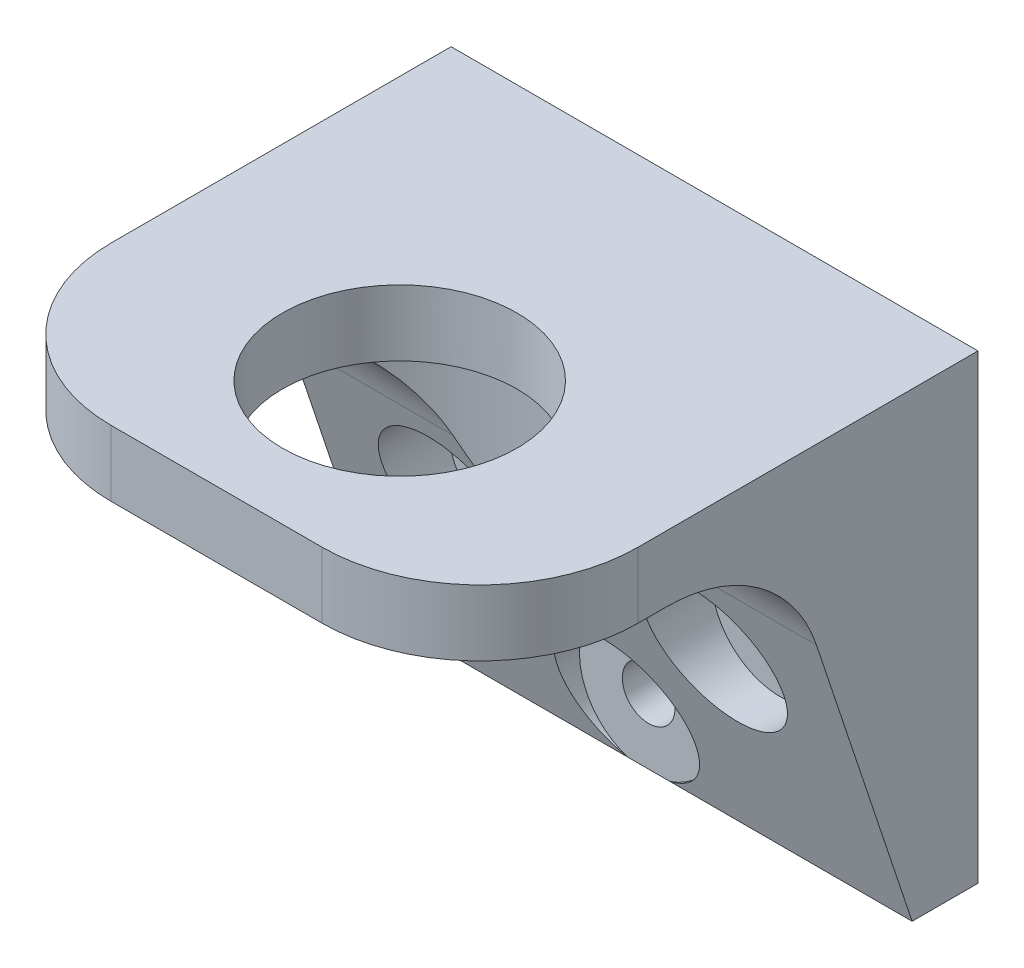
ISO-10303-21;
HEADER;
FILE_DESCRIPTION(('STEP AP214'),'2;1');
FILE_NAME('part.step','',(''),(''),'','','');
FILE_SCHEMA(('AUTOMOTIVE_DESIGN { 1 0 10303 214 1 1 1 1 }'));
ENDSEC;
DATA;
#1=APPLICATION_CONTEXT('core data for automotive mechanical design processes');
#2=APPLICATION_PROTOCOL_DEFINITION('international standard','automotive_design',2000,#1);
#3=PRODUCT_CONTEXT('',#1,'mechanical');
#4=PRODUCT('Part','Part','',(#3));
#5=PRODUCT_RELATED_PRODUCT_CATEGORY('part','',(#4));
#6=PRODUCT_DEFINITION_FORMATION('','',#4);
#7=PRODUCT_DEFINITION_CONTEXT('part definition',#1,'design');
#8=PRODUCT_DEFINITION('design','',#6,#7);
#9=PRODUCT_DEFINITION_SHAPE('','',#8);
#10=(LENGTH_UNIT() NAMED_UNIT(*) SI_UNIT(.MILLI.,.METRE.));
#11=(NAMED_UNIT(*) PLANE_ANGLE_UNIT() SI_UNIT($,.RADIAN.));
#12=(NAMED_UNIT(*) SI_UNIT($,.STERADIAN.) SOLID_ANGLE_UNIT());
#13=UNCERTAINTY_MEASURE_WITH_UNIT(LENGTH_MEASURE(1.E-05),#10,'distance_accuracy_value','');
#14=(GEOMETRIC_REPRESENTATION_CONTEXT(3) GLOBAL_UNCERTAINTY_ASSIGNED_CONTEXT((#13)) GLOBAL_UNIT_ASSIGNED_CONTEXT((#10,
#11,#12)) REPRESENTATION_CONTEXT('',''));
#15=CARTESIAN_POINT('',(0.,0.,0.));
#16=DIRECTION('',(0.,0.,1.));
#17=DIRECTION('',(1.,0.,0.));
#18=AXIS2_PLACEMENT_3D('',#15,#16,#17);
#19=CARTESIAN_POINT('',(0.,38.1,19.05));
#20=DIRECTION('',(0.,-0.316227766016838,0.948683298050514));
#21=DIRECTION('',(0.,-0.948683298050514,-0.316227766016838));
#22=AXIS2_PLACEMENT_3D('',#19,#20,#21);
#23=PLANE('',#22);
#24=CARTESIAN_POINT('',(38.1,19.05,12.7));
#25=DIRECTION('',(0.,-0.316227766016838,0.948683298050514));
#26=DIRECTION('',(0.,0.948683298050514,0.316227766016838));
#27=AXIS2_PLACEMENT_3D('',#24,#25,#26);
#28=ELLIPSE('',#27,7.02816209972422,6.6675);
#29=CARTESIAN_POINT('',(38.1,25.7175,14.9225));
#30=VERTEX_POINT('',#29);
#31=EDGE_CURVE('E207',#30,#30,#28,.T.);
#32=ORIENTED_EDGE('',*,*,#31,.F.);
#33=EDGE_LOOP('',(#32));
#34=FACE_BOUND('',#33,.T.);
#35=CARTESIAN_POINT('',(12.7,19.05,12.7));
#36=DIRECTION('',(0.,-0.316227766016838,0.948683298050514));
#37=DIRECTION('',(0.,0.948683298050514,0.316227766016838));
#38=AXIS2_PLACEMENT_3D('',#35,#36,#37);
#39=ELLIPSE('',#38,7.02816209972422,6.6675);
#40=CARTESIAN_POINT('',(12.7,25.7175,14.9225));
#41=VERTEX_POINT('',#40);
#42=EDGE_CURVE('E205',#41,#41,#39,.T.);
#43=ORIENTED_EDGE('',*,*,#42,.F.);
#44=EDGE_LOOP('',(#43));
#45=FACE_BOUND('',#44,.T.);
#46=CARTESIAN_POINT('',(25.4,72.009,30.353));
#47=DIRECTION('',(0.,-0.316227766016838,0.948683298050514));
#48=DIRECTION('',(0.,0.948683298050514,0.316227766016838));
#49=AXIS2_PLACEMENT_3D('',#46,#47,#48);
#50=ELLIPSE('',#49,55.8236875349524,17.653);
#51=CARTESIAN_POINT('',(35.0582398202283,27.6793111540966,15.5764370513655));
#52=VERTEX_POINT('',#51);
#53=CARTESIAN_POINT('',(15.7417601797717,27.6793111540966,15.5764370513655));
#54=VERTEX_POINT('',#53);
#55=EDGE_CURVE('E153',#52,#54,#50,.F.);
#56=ORIENTED_EDGE('',*,*,#55,.T.);
#57=DIRECTION('',(1.,0.,0.));
#58=VECTOR('',#57,1.);
#59=CARTESIAN_POINT('',(0.,27.6793111540966,15.5764370513655));
#60=LINE('',#59,#58);
#61=CARTESIAN_POINT('',(0.,27.6793111540966,15.5764370513655));
#62=VERTEX_POINT('',#61);
#63=EDGE_CURVE('E223',#54,#62,#60,.F.);
#64=ORIENTED_EDGE('',*,*,#63,.T.);
#65=DIRECTION('',(0.,-0.948683298050514,-0.316227766016838));
#66=VECTOR('',#65,1.);
#67=CARTESIAN_POINT('',(0.,38.1,19.05));
#68=LINE('',#67,#66);
#69=CARTESIAN_POINT('',(0.,0.,6.35));
#70=VERTEX_POINT('',#69);
#71=EDGE_CURVE('E323',#62,#70,#68,.T.);
#72=ORIENTED_EDGE('',*,*,#71,.T.);
#73=DIRECTION('',(1.,0.,0.));
#74=VECTOR('',#73,1.);
#75=CARTESIAN_POINT('',(0.,0.,6.35));
#76=LINE('',#75,#74);
#77=CARTESIAN_POINT('',(23.367008054615,0.,6.35));
#78=VERTEX_POINT('',#77);
#79=EDGE_CURVE('E161',#70,#78,#76,.T.);
#80=ORIENTED_EDGE('',*,*,#79,.T.);
#81=CARTESIAN_POINT('',(25.4,6.35,8.46666666666667));
#82=DIRECTION('',(0.,-0.316227766016838,0.948683298050514));
#83=DIRECTION('',(0.,0.948683298050514,0.316227766016838));
#84=AXIS2_PLACEMENT_3D('',#81,#82,#83);
#85=ELLIPSE('',#84,7.02816209972422,6.6675);
#86=CARTESIAN_POINT('',(27.432991945385,0.,6.35));
#87=VERTEX_POINT('',#86);
#88=EDGE_CURVE('E151',#87,#78,#85,.T.);
#89=ORIENTED_EDGE('',*,*,#88,.F.);
#90=CARTESIAN_POINT('',(50.8,0.,6.35));
#91=VERTEX_POINT('',#90);
#92=EDGE_CURVE('E159',#87,#91,#76,.T.);
#93=ORIENTED_EDGE('',*,*,#92,.T.);
#94=DIRECTION('',(0.,-0.948683298050514,-0.316227766016838));
#95=VECTOR('',#94,1.);
#96=CARTESIAN_POINT('',(50.8,38.1,19.05));
#97=LINE('',#96,#95);
#98=CARTESIAN_POINT('',(50.8,27.6793111540966,15.5764370513655));
#99=VERTEX_POINT('',#98);
#100=EDGE_CURVE('E195',#99,#91,#97,.T.);
#101=ORIENTED_EDGE('',*,*,#100,.F.);
#102=DIRECTION('',(1.,0.,0.));
#103=VECTOR('',#102,1.);
#104=CARTESIAN_POINT('',(38.9598893800798,27.6793111540966,15.5764370513655));
#105=LINE('',#104,#103);
#106=EDGE_CURVE('E221',#99,#52,#105,.F.);
#107=ORIENTED_EDGE('',*,*,#106,.T.);
#108=EDGE_LOOP('',(#56,#64,#72,#80,#89,#93,#101,#107));
#109=FACE_BOUND('',#108,.T.);
#110=ADVANCED_FACE('F38',(#34,#45,#109),#23,.T.);
#111=CARTESIAN_POINT('',(12.7,19.05,50.8));
#112=DIRECTION('',(0.,0.,-1.));
#113=DIRECTION('',(-1.,0.,0.));
#114=AXIS2_PLACEMENT_3D('',#111,#112,#113);
#115=CYLINDRICAL_SURFACE('',#114,2.54);
#116=CARTESIAN_POINT('',(12.7,19.05,0.));
#117=DIRECTION('',(0.,0.,-1.));
#118=DIRECTION('',(-1.,0.,0.));
#119=AXIS2_PLACEMENT_3D('',#116,#117,#118);
#120=CIRCLE('',#119,2.54);
#121=CARTESIAN_POINT('',(10.16,19.05,0.));
#122=VERTEX_POINT('',#121);
#123=EDGE_CURVE('E211',#122,#122,#120,.T.);
#124=ORIENTED_EDGE('',*,*,#123,.T.);
#125=EDGE_LOOP('',(#124));
#126=FACE_BOUND('',#125,.T.);
#127=CARTESIAN_POINT('',(12.7,19.05,6.35));
#128=DIRECTION('',(0.,0.,1.));
#129=DIRECTION('',(1.,0.,0.));
#130=AXIS2_PLACEMENT_3D('',#127,#128,#129);
#131=CIRCLE('',#130,2.54);
#132=CARTESIAN_POINT('',(15.24,19.05,6.35));
#133=VERTEX_POINT('',#132);
#134=EDGE_CURVE('E202',#133,#133,#131,.F.);
#135=ORIENTED_EDGE('',*,*,#134,.F.);
#136=EDGE_LOOP('',(#135));
#137=FACE_BOUND('',#136,.T.);
#138=ADVANCED_FACE('F283',(#126,#137),#115,.F.);
#139=CARTESIAN_POINT('',(38.1,19.05,50.8));
#140=DIRECTION('',(0.,0.,-1.));
#141=DIRECTION('',(-1.,0.,0.));
#142=AXIS2_PLACEMENT_3D('',#139,#140,#141);
#143=CYLINDRICAL_SURFACE('',#142,2.54);
#144=CARTESIAN_POINT('',(38.1,19.05,0.));
#145=DIRECTION('',(0.,0.,-1.));
#146=DIRECTION('',(-1.,0.,0.));
#147=AXIS2_PLACEMENT_3D('',#144,#145,#146);
#148=CIRCLE('',#147,2.54);
#149=CARTESIAN_POINT('',(35.56,19.05,0.));
#150=VERTEX_POINT('',#149);
#151=EDGE_CURVE('E342',#150,#150,#148,.T.);
#152=ORIENTED_EDGE('',*,*,#151,.T.);
#153=EDGE_LOOP('',(#152));
#154=FACE_BOUND('',#153,.T.);
#155=CARTESIAN_POINT('',(38.1,19.05,6.35));
#156=DIRECTION('',(0.,0.,1.));
#157=DIRECTION('',(1.,0.,0.));
#158=AXIS2_PLACEMENT_3D('',#155,#156,#157);
#159=CIRCLE('',#158,2.54);
#160=CARTESIAN_POINT('',(40.64,19.05,6.35));
#161=VERTEX_POINT('',#160);
#162=EDGE_CURVE('E145',#161,#161,#159,.F.);
#163=ORIENTED_EDGE('',*,*,#162,.F.);
#164=EDGE_LOOP('',(#163));
#165=FACE_BOUND('',#164,.T.);
#166=ADVANCED_FACE('F279',(#154,#165),#143,.F.);
#167=CARTESIAN_POINT('',(25.4,6.35,50.8));
#168=DIRECTION('',(0.,0.,-1.));
#169=DIRECTION('',(-1.,0.,0.));
#170=AXIS2_PLACEMENT_3D('',#167,#168,#169);
#171=CYLINDRICAL_SURFACE('',#170,2.54);
#172=CARTESIAN_POINT('',(25.4,6.35,0.));
#173=DIRECTION('',(0.,0.,-1.));
#174=DIRECTION('',(-1.,0.,0.));
#175=AXIS2_PLACEMENT_3D('',#172,#173,#174);
#176=CIRCLE('',#175,2.54);
#177=CARTESIAN_POINT('',(22.86,6.35,0.));
#178=VERTEX_POINT('',#177);
#179=EDGE_CURVE('E339',#178,#178,#176,.T.);
#180=ORIENTED_EDGE('',*,*,#179,.T.);
#181=EDGE_LOOP('',(#180));
#182=FACE_BOUND('',#181,.T.);
#183=CARTESIAN_POINT('',(25.4,6.35,6.35));
#184=DIRECTION('',(0.,0.,1.));
#185=DIRECTION('',(1.,0.,0.));
#186=AXIS2_PLACEMENT_3D('',#183,#184,#185);
#187=CIRCLE('',#186,2.54);
#188=CARTESIAN_POINT('',(27.94,6.35,6.35));
#189=VERTEX_POINT('',#188);
#190=EDGE_CURVE('E146',#189,#189,#187,.F.);
#191=ORIENTED_EDGE('',*,*,#190,.F.);
#192=EDGE_LOOP('',(#191));
#193=FACE_BOUND('',#192,.T.);
#194=ADVANCED_FACE('F275',(#182,#193),#171,.F.);
#195=CARTESIAN_POINT('',(0.,0.,6.35));
#196=DIRECTION('',(1.,0.,0.));
#197=DIRECTION('',(0.,0.,-1.));
#198=AXIS2_PLACEMENT_3D('',#195,#196,#197);
#199=PLANE('',#198);
#200=DIRECTION('',(0.,0.,-1.));
#201=VECTOR('',#200,1.);
#202=CARTESIAN_POINT('',(0.,38.1,48.006));
#203=LINE('',#202,#201);
#204=CARTESIAN_POINT('',(0.,38.1,32.766));
#205=VERTEX_POINT('',#204);
#206=CARTESIAN_POINT('',(0.,38.1,30.0343705136554));
#207=VERTEX_POINT('',#206);
#208=EDGE_CURVE('E318',#205,#207,#203,.T.);
#209=ORIENTED_EDGE('',*,*,#208,.F.);
#210=DIRECTION('',(0.,-1.,0.));
#211=VECTOR('',#210,1.);
#212=CARTESIAN_POINT('',(0.,44.45,32.766));
#213=LINE('',#212,#211);
#214=CARTESIAN_POINT('',(0.,44.45,32.766));
#215=VERTEX_POINT('',#214);
#216=EDGE_CURVE('E59',#205,#215,#213,.F.);
#217=ORIENTED_EDGE('',*,*,#216,.T.);
#218=DIRECTION('',(0.,0.,-1.));
#219=VECTOR('',#218,1.);
#220=CARTESIAN_POINT('',(0.,44.45,6.35));
#221=LINE('',#220,#219);
#222=CARTESIAN_POINT('',(0.,44.45,0.));
#223=VERTEX_POINT('',#222);
#224=EDGE_CURVE('E170',#215,#223,#221,.T.);
#225=ORIENTED_EDGE('',*,*,#224,.T.);
#226=DIRECTION('',(0.,-1.,0.));
#227=VECTOR('',#226,1.);
#228=CARTESIAN_POINT('',(0.,0.,0.));
#229=LINE('',#228,#227);
#230=CARTESIAN_POINT('',(0.,0.,0.));
#231=VERTEX_POINT('',#230);
#232=EDGE_CURVE('E178',#223,#231,#229,.T.);
#233=ORIENTED_EDGE('',*,*,#232,.T.);
#234=DIRECTION('',(0.,0.,-1.));
#235=VECTOR('',#234,1.);
#236=CARTESIAN_POINT('',(0.,0.,6.35));
#237=LINE('',#236,#235);
#238=EDGE_CURVE('E163',#70,#231,#237,.T.);
#239=ORIENTED_EDGE('',*,*,#238,.F.);
#240=ORIENTED_EDGE('',*,*,#71,.F.);
#241=CARTESIAN_POINT('',(0.,22.86,30.0343705136554));
#242=DIRECTION('',(1.,0.,0.));
#243=DIRECTION('',(0.,0.,-1.));
#244=AXIS2_PLACEMENT_3D('',#241,#242,#243);
#245=CIRCLE('',#244,15.24);
#246=EDGE_CURVE('E244',#62,#207,#245,.T.);
#247=ORIENTED_EDGE('',*,*,#246,.T.);
#248=EDGE_LOOP('',(#209,#217,#225,#233,#239,#240,#247));
#249=FACE_BOUND('',#248,.T.);
#250=ADVANCED_FACE('F278',(#249),#199,.F.);
#251=CARTESIAN_POINT('',(0.,0.,6.35));
#252=DIRECTION('',(0.,1.,0.));
#253=DIRECTION('',(0.,0.,1.));
#254=AXIS2_PLACEMENT_3D('',#251,#252,#253);
#255=PLANE('',#254);
#256=DIRECTION('',(1.,0.,0.));
#257=VECTOR('',#256,1.);
#258=CARTESIAN_POINT('',(0.,0.,0.));
#259=LINE('',#258,#257);
#260=CARTESIAN_POINT('',(50.8,0.,0.));
#261=VERTEX_POINT('',#260);
#262=EDGE_CURVE('E181',#231,#261,#259,.T.);
#263=ORIENTED_EDGE('',*,*,#262,.T.);
#264=DIRECTION('',(0.,0.,-1.));
#265=VECTOR('',#264,1.);
#266=CARTESIAN_POINT('',(50.8,0.,6.35));
#267=LINE('',#266,#265);
#268=EDGE_CURVE('E167',#91,#261,#267,.T.);
#269=ORIENTED_EDGE('',*,*,#268,.F.);
#270=ORIENTED_EDGE('',*,*,#92,.F.);
#271=DIRECTION('',(-1.,0.,0.));
#272=VECTOR('',#271,1.);
#273=CARTESIAN_POINT('',(0.,0.,6.35));
#274=LINE('',#273,#272);
#275=EDGE_CURVE('E135',#87,#78,#274,.T.);
#276=ORIENTED_EDGE('',*,*,#275,.T.);
#277=ORIENTED_EDGE('',*,*,#79,.F.);
#278=ORIENTED_EDGE('',*,*,#238,.T.);
#279=EDGE_LOOP('',(#263,#269,#270,#276,#277,#278));
#280=FACE_BOUND('',#279,.T.);
#281=ADVANCED_FACE('F165',(#280),#255,.F.);
#282=CARTESIAN_POINT('',(50.8,0.,6.35));
#283=DIRECTION('',(-1.,0.,0.));
#284=DIRECTION('',(0.,0.,1.));
#285=AXIS2_PLACEMENT_3D('',#282,#283,#284);
#286=PLANE('',#285);
#287=DIRECTION('',(0.,0.,-1.));
#288=VECTOR('',#287,1.);
#289=CARTESIAN_POINT('',(50.8,44.45,6.35));
#290=LINE('',#289,#288);
#291=CARTESIAN_POINT('',(50.8,44.45,32.766));
#292=VERTEX_POINT('',#291);
#293=CARTESIAN_POINT('',(50.8,44.45,0.));
#294=VERTEX_POINT('',#293);
#295=EDGE_CURVE('E187',#292,#294,#290,.T.);
#296=ORIENTED_EDGE('',*,*,#295,.F.);
#297=DIRECTION('',(0.,-1.,0.));
#298=VECTOR('',#297,1.);
#299=CARTESIAN_POINT('',(50.8,38.1,32.766));
#300=LINE('',#299,#298);
#301=CARTESIAN_POINT('',(50.8,38.1,32.766));
#302=VERTEX_POINT('',#301);
#303=EDGE_CURVE('E225',#292,#302,#300,.T.);
#304=ORIENTED_EDGE('',*,*,#303,.T.);
#305=DIRECTION('',(0.,0.,-1.));
#306=VECTOR('',#305,1.);
#307=CARTESIAN_POINT('',(50.8,38.1,48.006));
#308=LINE('',#307,#306);
#309=CARTESIAN_POINT('',(50.8,38.1,30.0343705136554));
#310=VERTEX_POINT('',#309);
#311=EDGE_CURVE('E332',#302,#310,#308,.T.);
#312=ORIENTED_EDGE('',*,*,#311,.T.);
#313=CARTESIAN_POINT('',(50.8,22.86,30.0343705136554));
#314=DIRECTION('',(-1.,0.,0.));
#315=DIRECTION('',(0.,0.,1.));
#316=AXIS2_PLACEMENT_3D('',#313,#314,#315);
#317=CIRCLE('',#316,15.24);
#318=EDGE_CURVE('E52',#310,#99,#317,.T.);
#319=ORIENTED_EDGE('',*,*,#318,.T.);
#320=ORIENTED_EDGE('',*,*,#100,.T.);
#321=ORIENTED_EDGE('',*,*,#268,.T.);
#322=DIRECTION('',(0.,1.,0.));
#323=VECTOR('',#322,1.);
#324=CARTESIAN_POINT('',(50.8,0.,0.));
#325=LINE('',#324,#323);
#326=EDGE_CURVE('E172',#261,#294,#325,.T.);
#327=ORIENTED_EDGE('',*,*,#326,.T.);
#328=EDGE_LOOP('',(#296,#304,#312,#319,#320,#321,#327));
#329=FACE_BOUND('',#328,.T.);
#330=ADVANCED_FACE('F308',(#329),#286,.F.);
#331=CARTESIAN_POINT('',(0.,44.45,6.35));
#332=DIRECTION('',(0.,-1.,0.));
#333=DIRECTION('',(0.,0.,-1.));
#334=AXIS2_PLACEMENT_3D('',#331,#332,#333);
#335=PLANE('',#334);
#336=CARTESIAN_POINT('',(25.4,44.45,30.353));
#337=DIRECTION('',(0.,1.,0.));
#338=DIRECTION('',(0.,0.,1.));
#339=AXIS2_PLACEMENT_3D('',#336,#337,#338);
#340=CIRCLE('',#339,11.303);
#341=CARTESIAN_POINT('',(25.4,44.45,41.656));
#342=VERTEX_POINT('',#341);
#343=EDGE_CURVE('E196',#342,#342,#340,.T.);
#344=ORIENTED_EDGE('',*,*,#343,.F.);
#345=EDGE_LOOP('',(#344));
#346=FACE_BOUND('',#345,.T.);
#347=DIRECTION('',(1.,0.,0.));
#348=VECTOR('',#347,1.);
#349=CARTESIAN_POINT('',(0.,44.45,48.006));
#350=LINE('',#349,#348);
#351=CARTESIAN_POINT('',(15.24,44.45,48.006));
#352=VERTEX_POINT('',#351);
#353=CARTESIAN_POINT('',(35.56,44.45,48.006));
#354=VERTEX_POINT('',#353);
#355=EDGE_CURVE('E176',#352,#354,#350,.T.);
#356=ORIENTED_EDGE('',*,*,#355,.T.);
#357=CARTESIAN_POINT('',(35.56,44.45,32.766));
#358=DIRECTION('',(0.,-1.,0.));
#359=DIRECTION('',(0.,0.,-1.));
#360=AXIS2_PLACEMENT_3D('',#357,#358,#359);
#361=CIRCLE('',#360,15.24);
#362=EDGE_CURVE('E234',#354,#292,#361,.F.);
#363=ORIENTED_EDGE('',*,*,#362,.T.);
#364=ORIENTED_EDGE('',*,*,#295,.T.);
#365=DIRECTION('',(-1.,0.,0.));
#366=VECTOR('',#365,1.);
#367=CARTESIAN_POINT('',(0.,44.45,0.));
#368=LINE('',#367,#366);
#369=EDGE_CURVE('E168',#294,#223,#368,.T.);
#370=ORIENTED_EDGE('',*,*,#369,.T.);
#371=ORIENTED_EDGE('',*,*,#224,.F.);
#372=CARTESIAN_POINT('',(15.24,44.45,32.766));
#373=DIRECTION('',(0.,-1.,0.));
#374=DIRECTION('',(0.,0.,-1.));
#375=AXIS2_PLACEMENT_3D('',#372,#373,#374);
#376=CIRCLE('',#375,15.24);
#377=EDGE_CURVE('E232',#215,#352,#376,.F.);
#378=ORIENTED_EDGE('',*,*,#377,.T.);
#379=EDGE_LOOP('',(#356,#363,#364,#370,#371,#378));
#380=FACE_BOUND('',#379,.T.);
#381=ADVANCED_FACE('F304',(#346,#380),#335,.F.);
#382=CARTESIAN_POINT('',(0.,0.,0.));
#383=DIRECTION('',(0.,0.,-1.));
#384=DIRECTION('',(-1.,0.,0.));
#385=AXIS2_PLACEMENT_3D('',#382,#383,#384);
#386=PLANE('',#385);
#387=ORIENTED_EDGE('',*,*,#179,.F.);
#388=EDGE_LOOP('',(#387));
#389=FACE_BOUND('',#388,.T.);
#390=ORIENTED_EDGE('',*,*,#151,.F.);
#391=EDGE_LOOP('',(#390));
#392=FACE_BOUND('',#391,.T.);
#393=ORIENTED_EDGE('',*,*,#123,.F.);
#394=EDGE_LOOP('',(#393));
#395=FACE_BOUND('',#394,.T.);
#396=ORIENTED_EDGE('',*,*,#232,.F.);
#397=ORIENTED_EDGE('',*,*,#369,.F.);
#398=ORIENTED_EDGE('',*,*,#326,.F.);
#399=ORIENTED_EDGE('',*,*,#262,.F.);
#400=EDGE_LOOP('',(#396,#397,#398,#399));
#401=FACE_BOUND('',#400,.T.);
#402=ADVANCED_FACE('F295',(#389,#392,#395,#401),#386,.T.);
#403=CARTESIAN_POINT('',(0.,38.1,48.006));
#404=DIRECTION('',(0.,-1.,0.));
#405=DIRECTION('',(0.,0.,-1.));
#406=AXIS2_PLACEMENT_3D('',#403,#404,#405);
#407=PLANE('',#406);
#408=CARTESIAN_POINT('',(25.4,38.1,30.353));
#409=DIRECTION('',(0.,-1.,0.));
#410=DIRECTION('',(0.,0.,-1.));
#411=AXIS2_PLACEMENT_3D('',#408,#409,#410);
#412=CIRCLE('',#411,11.303);
#413=CARTESIAN_POINT('',(25.4,38.1,19.05));
#414=VERTEX_POINT('',#413);
#415=EDGE_CURVE('E192',#414,#414,#412,.T.);
#416=ORIENTED_EDGE('',*,*,#415,.F.);
#417=EDGE_LOOP('',(#416));
#418=FACE_BOUND('',#417,.T.);
#419=ORIENTED_EDGE('',*,*,#208,.T.);
#420=DIRECTION('',(1.,0.,0.));
#421=VECTOR('',#420,1.);
#422=CARTESIAN_POINT('',(11.8401106199202,38.1,30.0343705136554));
#423=LINE('',#422,#421);
#424=CARTESIAN_POINT('',(7.74987580070803,38.1,30.0343705136554));
#425=VERTEX_POINT('',#424);
#426=EDGE_CURVE('E218',#207,#425,#423,.T.);
#427=ORIENTED_EDGE('',*,*,#426,.T.);
#428=CARTESIAN_POINT('',(25.4,38.1,30.353));
#429=DIRECTION('',(0.,-1.,0.));
#430=DIRECTION('',(0.,0.,-1.));
#431=AXIS2_PLACEMENT_3D('',#428,#429,#430);
#432=CIRCLE('',#431,17.653);
#433=CARTESIAN_POINT('',(43.050124199292,38.1,30.0343705136554));
#434=VERTEX_POINT('',#433);
#435=EDGE_CURVE('E352',#425,#434,#432,.T.);
#436=ORIENTED_EDGE('',*,*,#435,.T.);
#437=DIRECTION('',(1.,0.,0.));
#438=VECTOR('',#437,1.);
#439=CARTESIAN_POINT('',(50.8,38.1,30.0343705136554));
#440=LINE('',#439,#438);
#441=EDGE_CURVE('E215',#434,#310,#440,.T.);
#442=ORIENTED_EDGE('',*,*,#441,.T.);
#443=ORIENTED_EDGE('',*,*,#311,.F.);
#444=CARTESIAN_POINT('',(35.56,38.1,32.766));
#445=DIRECTION('',(0.,-1.,0.));
#446=DIRECTION('',(0.,0.,-1.));
#447=AXIS2_PLACEMENT_3D('',#444,#445,#446);
#448=CIRCLE('',#447,15.24);
#449=CARTESIAN_POINT('',(35.56,38.1,48.006));
#450=VERTEX_POINT('',#449);
#451=EDGE_CURVE('E213',#302,#450,#448,.T.);
#452=ORIENTED_EDGE('',*,*,#451,.T.);
#453=DIRECTION('',(1.,0.,0.));
#454=VECTOR('',#453,1.);
#455=CARTESIAN_POINT('',(0.,38.1,48.006));
#456=LINE('',#455,#454);
#457=CARTESIAN_POINT('',(15.24,38.1,48.006));
#458=VERTEX_POINT('',#457);
#459=EDGE_CURVE('E182',#458,#450,#456,.T.);
#460=ORIENTED_EDGE('',*,*,#459,.F.);
#461=CARTESIAN_POINT('',(15.24,38.1,32.766));
#462=DIRECTION('',(0.,-1.,0.));
#463=DIRECTION('',(0.,0.,-1.));
#464=AXIS2_PLACEMENT_3D('',#461,#462,#463);
#465=CIRCLE('',#464,15.24);
#466=EDGE_CURVE('E162',#458,#205,#465,.T.);
#467=ORIENTED_EDGE('',*,*,#466,.T.);
#468=EDGE_LOOP('',(#419,#427,#436,#442,#443,#452,#460,#467));
#469=FACE_BOUND('',#468,.T.);
#470=ADVANCED_FACE('F292',(#418,#469),#407,.T.);
#471=CARTESIAN_POINT('',(0.,44.45,48.006));
#472=DIRECTION('',(0.,0.,1.));
#473=DIRECTION('',(1.,0.,0.));
#474=AXIS2_PLACEMENT_3D('',#471,#472,#473);
#475=PLANE('',#474);
#476=ORIENTED_EDGE('',*,*,#459,.T.);
#477=DIRECTION('',(0.,-1.,0.));
#478=VECTOR('',#477,1.);
#479=CARTESIAN_POINT('',(35.56,44.45,48.006));
#480=LINE('',#479,#478);
#481=EDGE_CURVE('E67',#450,#354,#480,.F.);
#482=ORIENTED_EDGE('',*,*,#481,.T.);
#483=ORIENTED_EDGE('',*,*,#355,.F.);
#484=DIRECTION('',(0.,-1.,0.));
#485=VECTOR('',#484,1.);
#486=CARTESIAN_POINT('',(15.24,38.1,48.006));
#487=LINE('',#486,#485);
#488=EDGE_CURVE('E228',#352,#458,#487,.T.);
#489=ORIENTED_EDGE('',*,*,#488,.T.);
#490=EDGE_LOOP('',(#476,#482,#483,#489));
#491=FACE_BOUND('',#490,.T.);
#492=ADVANCED_FACE('F290',(#491),#475,.T.);
#493=CARTESIAN_POINT('',(25.4,-6.35,30.353));
#494=DIRECTION('',(0.,1.,0.));
#495=DIRECTION('',(0.,0.,1.));
#496=AXIS2_PLACEMENT_3D('',#493,#494,#495);
#497=CYLINDRICAL_SURFACE('',#496,11.303);
#498=ORIENTED_EDGE('',*,*,#415,.T.);
#499=EDGE_LOOP('',(#498));
#500=FACE_BOUND('',#499,.T.);
#501=ORIENTED_EDGE('',*,*,#343,.T.);
#502=EDGE_LOOP('',(#501));
#503=FACE_BOUND('',#502,.T.);
#504=ADVANCED_FACE('F257',(#500,#503),#497,.F.);
#505=CARTESIAN_POINT('',(25.4,6.35,6.35));
#506=DIRECTION('',(0.,0.,1.));
#507=DIRECTION('',(1.,0.,0.));
#508=AXIS2_PLACEMENT_3D('',#505,#506,#507);
#509=PLANE('',#508);
#510=CARTESIAN_POINT('',(25.4,6.35,6.35));
#511=DIRECTION('',(0.,0.,1.));
#512=DIRECTION('',(1.,0.,0.));
#513=AXIS2_PLACEMENT_3D('',#510,#511,#512);
#514=CIRCLE('',#513,6.6675);
#515=EDGE_CURVE('E139',#87,#78,#514,.T.);
#516=ORIENTED_EDGE('',*,*,#515,.T.);
#517=ORIENTED_EDGE('',*,*,#275,.F.);
#518=EDGE_LOOP('',(#516,#517));
#519=FACE_BOUND('',#518,.T.);
#520=ORIENTED_EDGE('',*,*,#190,.T.);
#521=EDGE_LOOP('',(#520));
#522=FACE_BOUND('',#521,.T.);
#523=ADVANCED_FACE('F137',(#519,#522),#509,.T.);
#524=CARTESIAN_POINT('',(25.4,6.35,6.35));
#525=DIRECTION('',(0.,0.,1.));
#526=DIRECTION('',(1.,0.,0.));
#527=AXIS2_PLACEMENT_3D('',#524,#525,#526);
#528=CYLINDRICAL_SURFACE('',#527,6.6675);
#529=ORIENTED_EDGE('',*,*,#88,.T.);
#530=ORIENTED_EDGE('',*,*,#515,.F.);
#531=EDGE_LOOP('',(#529,#530));
#532=FACE_BOUND('',#531,.T.);
#533=ADVANCED_FACE('F150',(#532),#528,.F.);
#534=CARTESIAN_POINT('',(38.1,19.05,6.35));
#535=DIRECTION('',(0.,0.,1.));
#536=DIRECTION('',(1.,0.,0.));
#537=AXIS2_PLACEMENT_3D('',#534,#535,#536);
#538=PLANE('',#537);
#539=CARTESIAN_POINT('',(38.1,19.05,6.35));
#540=DIRECTION('',(0.,0.,1.));
#541=DIRECTION('',(1.,0.,0.));
#542=AXIS2_PLACEMENT_3D('',#539,#540,#541);
#543=CIRCLE('',#542,6.6675);
#544=CARTESIAN_POINT('',(44.7675,19.05,6.35));
#545=VERTEX_POINT('',#544);
#546=EDGE_CURVE('E152',#545,#545,#543,.T.);
#547=ORIENTED_EDGE('',*,*,#546,.T.);
#548=EDGE_LOOP('',(#547));
#549=FACE_BOUND('',#548,.T.);
#550=ORIENTED_EDGE('',*,*,#162,.T.);
#551=EDGE_LOOP('',(#550));
#552=FACE_BOUND('',#551,.T.);
#553=ADVANCED_FACE('F260',(#549,#552),#538,.T.);
#554=CARTESIAN_POINT('',(38.1,19.05,6.35));
#555=DIRECTION('',(0.,0.,1.));
#556=DIRECTION('',(1.,0.,0.));
#557=AXIS2_PLACEMENT_3D('',#554,#555,#556);
#558=CYLINDRICAL_SURFACE('',#557,6.6675);
#559=ORIENTED_EDGE('',*,*,#31,.T.);
#560=EDGE_LOOP('',(#559));
#561=FACE_BOUND('',#560,.T.);
#562=ORIENTED_EDGE('',*,*,#546,.F.);
#563=EDGE_LOOP('',(#562));
#564=FACE_BOUND('',#563,.T.);
#565=ADVANCED_FACE('F263',(#561,#564),#558,.F.);
#566=CARTESIAN_POINT('',(12.7,19.05,6.35));
#567=DIRECTION('',(0.,0.,1.));
#568=DIRECTION('',(1.,0.,0.));
#569=AXIS2_PLACEMENT_3D('',#566,#567,#568);
#570=PLANE('',#569);
#571=CARTESIAN_POINT('',(12.7,19.05,6.35));
#572=DIRECTION('',(0.,0.,1.));
#573=DIRECTION('',(1.,0.,0.));
#574=AXIS2_PLACEMENT_3D('',#571,#572,#573);
#575=CIRCLE('',#574,6.6675);
#576=CARTESIAN_POINT('',(19.3675,19.05,6.35));
#577=VERTEX_POINT('',#576);
#578=EDGE_CURVE('E199',#577,#577,#575,.T.);
#579=ORIENTED_EDGE('',*,*,#578,.T.);
#580=EDGE_LOOP('',(#579));
#581=FACE_BOUND('',#580,.T.);
#582=ORIENTED_EDGE('',*,*,#134,.T.);
#583=EDGE_LOOP('',(#582));
#584=FACE_BOUND('',#583,.T.);
#585=ADVANCED_FACE('F267',(#581,#584),#570,.T.);
#586=CARTESIAN_POINT('',(12.7,19.05,6.35));
#587=DIRECTION('',(0.,0.,1.));
#588=DIRECTION('',(1.,0.,0.));
#589=AXIS2_PLACEMENT_3D('',#586,#587,#588);
#590=CYLINDRICAL_SURFACE('',#589,6.6675);
#591=ORIENTED_EDGE('',*,*,#42,.T.);
#592=EDGE_LOOP('',(#591));
#593=FACE_BOUND('',#592,.T.);
#594=ORIENTED_EDGE('',*,*,#578,.F.);
#595=EDGE_LOOP('',(#594));
#596=FACE_BOUND('',#595,.T.);
#597=ADVANCED_FACE('F252',(#593,#596),#590,.F.);
#598=CARTESIAN_POINT('',(25.4,-12.7,30.353));
#599=DIRECTION('',(0.,1.,0.));
#600=DIRECTION('',(0.,0.,1.));
#601=AXIS2_PLACEMENT_3D('',#598,#599,#600);
#602=CYLINDRICAL_SURFACE('',#601,17.653);
#603=ORIENTED_EDGE('',*,*,#435,.F.);
#604=CARTESIAN_POINT('',(7.74987580070803,38.1,30.0343705136554));
#605=CARTESIAN_POINT('',(7.75314027725246,38.1000023112712,29.8533884341091));
#606=CARTESIAN_POINT('',(7.75919416935945,38.0967752548699,29.6724844794268));
#607=CARTESIAN_POINT('',(7.77684102569531,38.0839046432114,29.3111850538442));
#608=CARTESIAN_POINT('',(7.7884336949556,38.074261429637,29.1307895563805));
#609=CARTESIAN_POINT('',(7.83143205071153,38.0357964641488,28.5912309767415));
#610=CARTESIAN_POINT('',(7.8710648926093,37.9974392080007,28.233326531407));
#611=CARTESIAN_POINT('',(7.97104059056192,37.8965288452783,27.5270436627428));
#612=CARTESIAN_POINT('',(8.0312097071244,37.8341781794256,27.1786109783852));
#613=CARTESIAN_POINT('',(8.17113424425381,37.6864414706187,26.4906403443032));
#614=CARTESIAN_POINT('',(8.25089249914591,37.6010520940491,26.1511036896075));
#615=CARTESIAN_POINT('',(8.42824443356263,37.4089619726758,25.4840451748729));
#616=CARTESIAN_POINT('',(8.52578704428233,37.3023221702135,25.1564920566903));
#617=CARTESIAN_POINT('',(8.73719056942282,37.0691603351369,24.5140303614292));
#618=CARTESIAN_POINT('',(8.85105085417187,36.9426390696969,24.199121297038));
#619=CARTESIAN_POINT('',(9.09358372114592,36.6710521021941,23.5825373564222));
#620=CARTESIAN_POINT('',(9.22228434663548,36.52595123184,23.28088907422));
#621=CARTESIAN_POINT('',(9.49257147252725,36.2189342693159,22.6922510908136));
#622=CARTESIAN_POINT('',(9.63416083390394,36.0570144426306,22.4052646663525));
#623=CARTESIAN_POINT('',(9.98669350713161,35.6507319915219,21.736011995274));
#624=CARTESIAN_POINT('',(10.202926845033,35.3990822386414,21.3609284054825));
#625=CARTESIAN_POINT('',(10.6525921732076,34.8692631385762,20.6410160233104));
#626=CARTESIAN_POINT('',(10.8860295775948,34.5910854348885,20.2961968305655));
#627=CARTESIAN_POINT('',(11.3662926695433,34.0102811212886,19.6361724886333));
#628=CARTESIAN_POINT('',(11.6131477132383,33.7076001305289,19.3210367642144));
#629=CARTESIAN_POINT('',(12.1154871204919,33.0802686140072,18.7210089456558));
#630=CARTESIAN_POINT('',(12.370971957094,32.7556168829335,18.4361185129743));
#631=CARTESIAN_POINT('',(12.897383478542,32.0708034404576,17.8844549738023));
#632=CARTESIAN_POINT('',(13.1684967937889,31.7097096363988,17.6190194030154));
#633=CARTESIAN_POINT('',(13.7095641101432,30.9650681838929,17.1205702560845));
#634=CARTESIAN_POINT('',(13.979518398697,30.5815264947358,16.8875481300407));
#635=CARTESIAN_POINT('',(14.3773559451482,29.989866501729,16.5631899102288));
#636=CARTESIAN_POINT('',(14.5084065710739,29.7905391659812,16.4595377798998));
#637=CARTESIAN_POINT('',(14.7673154633691,29.385832266354,16.2604104424805));
#638=CARTESIAN_POINT('',(14.8951740958816,29.1804534025726,16.1649342944685));
#639=CARTESIAN_POINT('',(15.1465328826659,28.7631360343979,15.9822333280312));
#640=CARTESIAN_POINT('',(15.2700289122283,28.5511916599662,15.895016193912));
#641=CARTESIAN_POINT('',(15.5109114449267,28.1204605091972,15.729187314892));
#642=CARTESIAN_POINT('',(15.6282955097846,27.901671057,15.650578990759));
#643=CARTESIAN_POINT('',(15.7417601797717,27.6793111540966,15.5764370513655));
#644=B_SPLINE_CURVE_WITH_KNOTS('',3,(#604,#605,#606,#607,#608,#609,#610,#611,#612,#613,#614,
#615,#616,#617,#618,#619,#620,#621,#622,#623,#624,#625,#626,#627,#628,#629,#630,#631,#632,#633,
#634,#635,#636,#637,#638,#639,#640,#641,#642,#643),.UNSPECIFIED.,.F.,.F.,(4,2,2,2,2,2,2,2,2,2,2,
2,2,2,2,2,2,2,2,4),(0.,0.542929745979194,1.08583058135694,2.17052863081573,3.24626856085963,
4.32216423000563,5.39501771624918,6.46782981401403,7.54270345647197,8.61781627832346,
10.1179348568506,11.6185275547838,13.1225470045404,14.6266490315763,16.1965417048627,
17.7660194891455,18.5461287821614,19.3261481763937,20.1068863243655,20.8879335867322),.UNSPECIFIED.);
#645=EDGE_CURVE('E237',#425,#54,#644,.T.);
#646=ORIENTED_EDGE('',*,*,#645,.T.);
#647=ORIENTED_EDGE('',*,*,#55,.F.);
#648=CARTESIAN_POINT('',(35.0582398202283,27.6793111540966,15.5764370513655));
#649=CARTESIAN_POINT('',(35.1769121859297,27.9118583310548,15.6539789939985));
#650=CARTESIAN_POINT('',(35.2998592451804,28.140501260136,15.7364019436202));
#651=CARTESIAN_POINT('',(35.5523521614754,28.5903114957768,15.9106501421095));
#652=CARTESIAN_POINT('',(35.6818951292445,28.8114820061201,16.0024712916909));
#653=CARTESIAN_POINT('',(35.9456103558422,29.2466747630672,16.1951325559255));
#654=CARTESIAN_POINT('',(36.0797781009011,29.4607035995774,16.2959640215211));
#655=CARTESIAN_POINT('',(36.3514252945031,29.8821860444016,16.5065473844303));
#656=CARTESIAN_POINT('',(36.4889051640075,30.0896388090737,16.6163004199028));
#657=CARTESIAN_POINT('',(36.9070219517367,30.7063860007262,16.9609154287379));
#658=CARTESIAN_POINT('',(37.1908447103433,31.1060470701547,17.2093451246646));
#659=CARTESIAN_POINT('',(37.7588098024702,31.8807240716177,17.7418917612073));
#660=CARTESIAN_POINT('',(38.0429522070594,32.255732449513,18.0260195635998));
#661=CARTESIAN_POINT('',(38.6043478826353,32.97955622188,18.629393845186));
#662=CARTESIAN_POINT('',(38.8816184194505,33.3284429454017,18.9485383481189));
#663=CARTESIAN_POINT('',(39.4243959977483,33.9994772942723,19.6230358198801));
#664=CARTESIAN_POINT('',(39.6899030667253,34.3216249821191,19.9783887040729));
#665=CARTESIAN_POINT('',(40.2026223945445,34.935164904992,20.7241465756798));
#666=CARTESIAN_POINT('',(40.4498986819666,35.2266664773431,21.1144170688131));
#667=CARTESIAN_POINT('',(40.9214403870186,35.7762635851641,21.930697795685));
#668=CARTESIAN_POINT('',(41.1457175471599,36.0343761855969,22.3566895874481));
#669=CARTESIAN_POINT('',(41.4969950466878,36.4345975774644,23.0987156782334));
#670=CARTESIAN_POINT('',(41.6319054025356,36.5871277306909,23.4054368648753));
#671=CARTESIAN_POINT('',(41.8866276940681,36.8731318855524,24.0336408072786));
#672=CARTESIAN_POINT('',(42.0064438973374,37.0066112748539,24.3551193554464));
#673=CARTESIAN_POINT('',(42.2288944333849,37.2525781590094,25.01104876408));
#674=CARTESIAN_POINT('',(42.3315599518823,37.3651037985418,25.345474686771));
#675=CARTESIAN_POINT('',(42.518153027153,37.5677436485095,26.0261435943124));
#676=CARTESIAN_POINT('',(42.6020839199398,37.6578618492901,26.3723844626349));
#677=CARTESIAN_POINT('',(42.7320286950287,37.7955218532953,26.9908668867689));
#678=CARTESIAN_POINT('',(42.7823126349665,37.8480921822984,27.2611073930251));
#679=CARTESIAN_POINT('',(42.87046659557,37.9387298896279,27.8059728599455));
#680=CARTESIAN_POINT('',(42.9083392792137,37.9768003793469,28.0805968668005));
#681=CARTESIAN_POINT('',(42.971331511262,38.0380990051292,28.6341208989634));
#682=CARTESIAN_POINT('',(42.9963975137346,38.0612649266923,28.913033935169));
#683=CARTESIAN_POINT('',(43.0332779465539,38.0922348740093,29.4727067557483));
#684=CARTESIAN_POINT('',(43.045086420529,38.1000319960228,29.7534673132465));
#685=CARTESIAN_POINT('',(43.050124199292,38.1,30.0343705136554));
#686=B_SPLINE_CURVE_WITH_KNOTS('',3,(#648,#649,#650,#651,#652,#653,#654,#655,#656,#657,#658,
#659,#660,#661,#662,#663,#664,#665,#666,#667,#668,#669,#670,#671,#672,#673,#674,#675,#676,#677,
#678,#679,#680,#681,#682,#683,#684,#685),.UNSPECIFIED.,.F.,.F.,(4,2,2,2,2,2,2,2,2,2,2,2,2,2,2,2,
2,2,4),(0.,0.816824032535091,1.63329329068773,2.44898706536492,3.26478506503215,
4.91150870508912,6.55873460869429,8.20128474248003,9.84383103697105,11.4803026686872,
13.1159345739507,14.2194582961858,15.3226693144907,16.4238519581572,17.5248383611333,
18.3637849302285,19.2025513756272,20.0447966579332,20.8874201948253),.UNSPECIFIED.);
#687=EDGE_CURVE('E11',#52,#434,#686,.T.);
#688=ORIENTED_EDGE('',*,*,#687,.T.);
#689=EDGE_LOOP('',(#603,#646,#647,#688));
#690=FACE_BOUND('',#689,.T.);
#691=ADVANCED_FACE('F248',(#690),#602,.F.);
#692=CARTESIAN_POINT('',(0.,22.86,30.0343705136554));
#693=DIRECTION('',(-1.,0.,0.));
#694=DIRECTION('',(0.,0.,1.));
#695=AXIS2_PLACEMENT_3D('',#692,#693,#694);
#696=CYLINDRICAL_SURFACE('',#695,15.24);
#697=ORIENTED_EDGE('',*,*,#246,.F.);
#698=ORIENTED_EDGE('',*,*,#63,.F.);
#699=ORIENTED_EDGE('',*,*,#645,.F.);
#700=ORIENTED_EDGE('',*,*,#426,.F.);
#701=EDGE_LOOP('',(#697,#698,#699,#700));
#702=FACE_BOUND('',#701,.T.);
#703=ADVANCED_FACE('F245',(#702),#696,.F.);
#704=CARTESIAN_POINT('',(0.,22.86,30.0343705136554));
#705=DIRECTION('',(-1.,0.,0.));
#706=DIRECTION('',(0.,0.,1.));
#707=AXIS2_PLACEMENT_3D('',#704,#705,#706);
#708=CYLINDRICAL_SURFACE('',#707,15.24);
#709=ORIENTED_EDGE('',*,*,#687,.F.);
#710=ORIENTED_EDGE('',*,*,#106,.F.);
#711=ORIENTED_EDGE('',*,*,#318,.F.);
#712=ORIENTED_EDGE('',*,*,#441,.F.);
#713=EDGE_LOOP('',(#709,#710,#711,#712));
#714=FACE_BOUND('',#713,.T.);
#715=ADVANCED_FACE('F360',(#714),#708,.F.);
#716=CARTESIAN_POINT('',(35.56,0.,32.766));
#717=DIRECTION('',(0.,1.,0.));
#718=DIRECTION('',(0.,0.,1.));
#719=AXIS2_PLACEMENT_3D('',#716,#717,#718);
#720=CYLINDRICAL_SURFACE('',#719,15.24);
#721=ORIENTED_EDGE('',*,*,#362,.F.);
#722=ORIENTED_EDGE('',*,*,#481,.F.);
#723=ORIENTED_EDGE('',*,*,#451,.F.);
#724=ORIENTED_EDGE('',*,*,#303,.F.);
#725=EDGE_LOOP('',(#721,#722,#723,#724));
#726=FACE_BOUND('',#725,.T.);
#727=ADVANCED_FACE('F368',(#726),#720,.T.);
#728=CARTESIAN_POINT('',(15.24,44.45,32.766));
#729=DIRECTION('',(0.,1.,0.));
#730=DIRECTION('',(0.,0.,1.));
#731=AXIS2_PLACEMENT_3D('',#728,#729,#730);
#732=CYLINDRICAL_SURFACE('',#731,15.24);
#733=ORIENTED_EDGE('',*,*,#377,.F.);
#734=ORIENTED_EDGE('',*,*,#216,.F.);
#735=ORIENTED_EDGE('',*,*,#466,.F.);
#736=ORIENTED_EDGE('',*,*,#488,.F.);
#737=EDGE_LOOP('',(#733,#734,#735,#736));
#738=FACE_BOUND('',#737,.T.);
#739=ADVANCED_FACE('F40',(#738),#732,.T.);
#740=CLOSED_SHELL('',(#110,#138,#166,#194,#250,#281,#330,#381,#402,#470,#492,#504,#523,#533,
#553,#565,#585,#597,#691,#703,#715,#727,#739));
#741=MANIFOLD_SOLID_BREP('B2',#740);
#742=ADVANCED_BREP_SHAPE_REPRESENTATION('',(#18,#741),#14);
#743=SHAPE_DEFINITION_REPRESENTATION(#9,#742);
ENDSEC;
END-ISO-10303-21;
